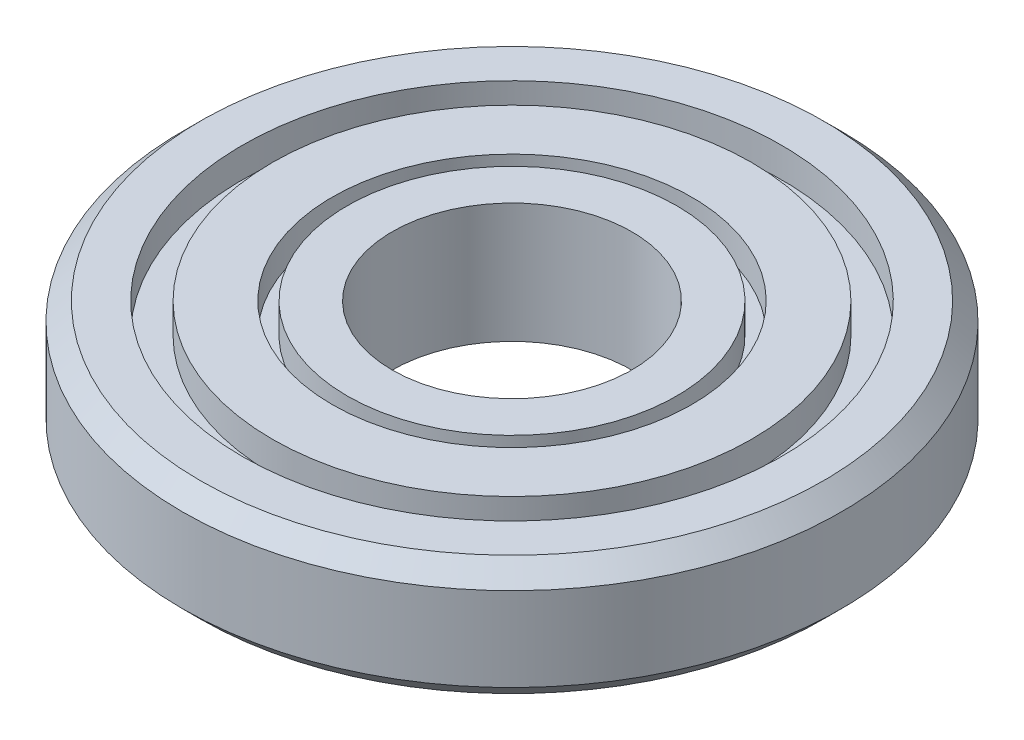
ISO-10303-21;
HEADER;
FILE_DESCRIPTION(('STEP AP214'),'2;1');
FILE_NAME('part.step','',(''),(''),'','','');
FILE_SCHEMA(('AUTOMOTIVE_DESIGN { 1 0 10303 214 1 1 1 1 }'));
ENDSEC;
DATA;
#1=APPLICATION_CONTEXT('core data for automotive mechanical design processes');
#2=APPLICATION_PROTOCOL_DEFINITION('international standard','automotive_design',2000,#1);
#3=PRODUCT_CONTEXT('',#1,'mechanical');
#4=PRODUCT('Part','Part','',(#3));
#5=PRODUCT_RELATED_PRODUCT_CATEGORY('part','',(#4));
#6=PRODUCT_DEFINITION_FORMATION('','',#4);
#7=PRODUCT_DEFINITION_CONTEXT('part definition',#1,'design');
#8=PRODUCT_DEFINITION('design','',#6,#7);
#9=PRODUCT_DEFINITION_SHAPE('','',#8);
#10=(LENGTH_UNIT() NAMED_UNIT(*) SI_UNIT(.MILLI.,.METRE.));
#11=(NAMED_UNIT(*) PLANE_ANGLE_UNIT() SI_UNIT($,.RADIAN.));
#12=(NAMED_UNIT(*) SI_UNIT($,.STERADIAN.) SOLID_ANGLE_UNIT());
#13=UNCERTAINTY_MEASURE_WITH_UNIT(LENGTH_MEASURE(1.E-05),#10,'distance_accuracy_value','');
#14=(GEOMETRIC_REPRESENTATION_CONTEXT(3) GLOBAL_UNCERTAINTY_ASSIGNED_CONTEXT((#13)) GLOBAL_UNIT_ASSIGNED_CONTEXT((#10,
#11,#12)) REPRESENTATION_CONTEXT('',''));
#15=CARTESIAN_POINT('',(0.,0.,0.));
#16=DIRECTION('',(0.,0.,1.));
#17=DIRECTION('',(1.,0.,0.));
#18=AXIS2_PLACEMENT_3D('',#15,#16,#17);
#19=CARTESIAN_POINT('',(0.,0.,0.));
#20=DIRECTION('',(0.,1.,0.));
#21=DIRECTION('',(0.,0.,1.));
#22=AXIS2_PLACEMENT_3D('',#19,#20,#21);
#23=PLANE('',#22);
#24=CARTESIAN_POINT('',(0.,0.,0.));
#25=DIRECTION('',(0.,1.,0.));
#26=DIRECTION('',(0.,0.,1.));
#27=AXIS2_PLACEMENT_3D('',#24,#25,#26);
#28=CIRCLE('',#27,2.);
#29=CARTESIAN_POINT('',(0.,0.,2.));
#30=VERTEX_POINT('',#29);
#31=EDGE_CURVE('E63',#30,#30,#28,.T.);
#32=ORIENTED_EDGE('',*,*,#31,.T.);
#33=EDGE_LOOP('',(#32));
#34=FACE_BOUND('',#33,.T.);
#35=CARTESIAN_POINT('',(0.,0.,0.));
#36=DIRECTION('',(0.,-1.,0.));
#37=DIRECTION('',(0.,0.,-1.));
#38=AXIS2_PLACEMENT_3D('',#35,#36,#37);
#39=CIRCLE('',#38,2.75);
#40=CARTESIAN_POINT('',(0.,0.,-2.75));
#41=VERTEX_POINT('',#40);
#42=EDGE_CURVE('E109',#41,#41,#39,.T.);
#43=ORIENTED_EDGE('',*,*,#42,.T.);
#44=EDGE_LOOP('',(#43));
#45=FACE_BOUND('',#44,.T.);
#46=ADVANCED_FACE('F42',(#34,#45),#23,.F.);
#47=CARTESIAN_POINT('',(0.,0.,0.));
#48=DIRECTION('',(0.,-1.,0.));
#49=DIRECTION('',(0.,0.,-1.));
#50=AXIS2_PLACEMENT_3D('',#47,#48,#49);
#51=CIRCLE('',#50,3.);
#52=CARTESIAN_POINT('',(0.,0.,-3.));
#53=VERTEX_POINT('',#52);
#54=EDGE_CURVE('E105',#53,#53,#51,.T.);
#55=ORIENTED_EDGE('',*,*,#54,.F.);
#56=EDGE_LOOP('',(#55));
#57=FACE_BOUND('',#56,.T.);
#58=CARTESIAN_POINT('',(0.,0.,0.));
#59=DIRECTION('',(0.,-1.,0.));
#60=DIRECTION('',(0.,0.,-1.));
#61=AXIS2_PLACEMENT_3D('',#58,#59,#60);
#62=CIRCLE('',#61,4.);
#63=CARTESIAN_POINT('',(0.,0.,-4.));
#64=VERTEX_POINT('',#63);
#65=EDGE_CURVE('E97',#64,#64,#62,.T.);
#66=ORIENTED_EDGE('',*,*,#65,.T.);
#67=EDGE_LOOP('',(#66));
#68=FACE_BOUND('',#67,.T.);
#69=ADVANCED_FACE('F133',(#57,#68),#23,.F.);
#70=CARTESIAN_POINT('',(0.,2.,0.));
#71=DIRECTION('',(0.,1.,0.));
#72=DIRECTION('',(0.,0.,1.));
#73=AXIS2_PLACEMENT_3D('',#70,#71,#72);
#74=PLANE('',#73);
#75=CARTESIAN_POINT('',(0.,2.,0.));
#76=DIRECTION('',(0.,1.,0.));
#77=DIRECTION('',(0.,0.,1.));
#78=AXIS2_PLACEMENT_3D('',#75,#76,#77);
#79=CIRCLE('',#78,3.);
#80=CARTESIAN_POINT('',(0.,2.,3.));
#81=VERTEX_POINT('',#80);
#82=EDGE_CURVE('E69',#81,#81,#79,.T.);
#83=ORIENTED_EDGE('',*,*,#82,.F.);
#84=EDGE_LOOP('',(#83));
#85=FACE_BOUND('',#84,.T.);
#86=CARTESIAN_POINT('',(0.,2.,0.));
#87=DIRECTION('',(0.,1.,0.));
#88=DIRECTION('',(0.,0.,1.));
#89=AXIS2_PLACEMENT_3D('',#86,#87,#88);
#90=CIRCLE('',#89,4.);
#91=CARTESIAN_POINT('',(0.,2.,4.));
#92=VERTEX_POINT('',#91);
#93=EDGE_CURVE('E85',#92,#92,#90,.T.);
#94=ORIENTED_EDGE('',*,*,#93,.T.);
#95=EDGE_LOOP('',(#94));
#96=FACE_BOUND('',#95,.T.);
#97=ADVANCED_FACE('F136',(#85,#96),#74,.T.);
#98=CARTESIAN_POINT('',(0.,2.,0.));
#99=DIRECTION('',(0.,1.,0.));
#100=DIRECTION('',(0.,0.,1.));
#101=AXIS2_PLACEMENT_3D('',#98,#99,#100);
#102=CIRCLE('',#101,2.);
#103=CARTESIAN_POINT('',(0.,2.,2.));
#104=VERTEX_POINT('',#103);
#105=EDGE_CURVE('E62',#104,#104,#102,.T.);
#106=ORIENTED_EDGE('',*,*,#105,.F.);
#107=EDGE_LOOP('',(#106));
#108=FACE_BOUND('',#107,.T.);
#109=CARTESIAN_POINT('',(0.,2.,0.));
#110=DIRECTION('',(0.,1.,0.));
#111=DIRECTION('',(0.,0.,1.));
#112=AXIS2_PLACEMENT_3D('',#109,#110,#111);
#113=CIRCLE('',#112,2.75);
#114=CARTESIAN_POINT('',(0.,2.,2.75));
#115=VERTEX_POINT('',#114);
#116=EDGE_CURVE('E73',#115,#115,#113,.T.);
#117=ORIENTED_EDGE('',*,*,#116,.T.);
#118=EDGE_LOOP('',(#117));
#119=FACE_BOUND('',#118,.T.);
#120=ADVANCED_FACE('F172',(#108,#119),#74,.T.);
#121=CARTESIAN_POINT('',(0.,2.,0.));
#122=DIRECTION('',(0.,1.,0.));
#123=DIRECTION('',(0.,0.,1.));
#124=AXIS2_PLACEMENT_3D('',#121,#122,#123);
#125=CIRCLE('',#124,5.2);
#126=CARTESIAN_POINT('',(0.,2.,5.2));
#127=VERTEX_POINT('',#126);
#128=EDGE_CURVE('E57',#127,#127,#125,.T.);
#129=ORIENTED_EDGE('',*,*,#128,.T.);
#130=EDGE_LOOP('',(#129));
#131=FACE_BOUND('',#130,.T.);
#132=CARTESIAN_POINT('',(0.,2.,0.));
#133=DIRECTION('',(0.,1.,0.));
#134=DIRECTION('',(0.,0.,1.));
#135=AXIS2_PLACEMENT_3D('',#132,#133,#134);
#136=CIRCLE('',#135,4.5);
#137=CARTESIAN_POINT('',(0.,2.,4.5));
#138=VERTEX_POINT('',#137);
#139=EDGE_CURVE('E81',#138,#138,#136,.T.);
#140=ORIENTED_EDGE('',*,*,#139,.F.);
#141=EDGE_LOOP('',(#140));
#142=FACE_BOUND('',#141,.T.);
#143=ADVANCED_FACE('F166',(#131,#142),#74,.T.);
#144=CARTESIAN_POINT('',(0.,0.,0.));
#145=DIRECTION('',(0.,1.,0.));
#146=DIRECTION('',(0.,0.,1.));
#147=AXIS2_PLACEMENT_3D('',#144,#145,#146);
#148=CIRCLE('',#147,5.2);
#149=CARTESIAN_POINT('',(0.,0.,5.2));
#150=VERTEX_POINT('',#149);
#151=EDGE_CURVE('E11',#150,#150,#148,.F.);
#152=ORIENTED_EDGE('',*,*,#151,.T.);
#153=EDGE_LOOP('',(#152));
#154=FACE_BOUND('',#153,.T.);
#155=CARTESIAN_POINT('',(0.,0.,0.));
#156=DIRECTION('',(0.,-1.,0.));
#157=DIRECTION('',(0.,0.,-1.));
#158=AXIS2_PLACEMENT_3D('',#155,#156,#157);
#159=CIRCLE('',#158,4.5);
#160=CARTESIAN_POINT('',(0.,0.,-4.5));
#161=VERTEX_POINT('',#160);
#162=EDGE_CURVE('E93',#161,#161,#159,.T.);
#163=ORIENTED_EDGE('',*,*,#162,.F.);
#164=EDGE_LOOP('',(#163));
#165=FACE_BOUND('',#164,.T.);
#166=ADVANCED_FACE('F138',(#154,#165),#23,.F.);
#167=CARTESIAN_POINT('',(0.,2.,0.));
#168=DIRECTION('',(0.,-1.,0.));
#169=DIRECTION('',(0.,0.,-1.));
#170=AXIS2_PLACEMENT_3D('',#167,#168,#169);
#171=CYLINDRICAL_SURFACE('',#170,5.5);
#172=CARTESIAN_POINT('',(0.,1.7,0.));
#173=DIRECTION('',(0.,1.,0.));
#174=DIRECTION('',(0.,0.,1.));
#175=AXIS2_PLACEMENT_3D('',#172,#173,#174);
#176=CIRCLE('',#175,5.5);
#177=CARTESIAN_POINT('',(0.,1.7,5.5));
#178=VERTEX_POINT('',#177);
#179=EDGE_CURVE('E49',#178,#178,#176,.F.);
#180=ORIENTED_EDGE('',*,*,#179,.T.);
#181=EDGE_LOOP('',(#180));
#182=FACE_BOUND('',#181,.T.);
#183=CARTESIAN_POINT('',(0.,0.3,0.));
#184=DIRECTION('',(0.,1.,0.));
#185=DIRECTION('',(0.,0.,1.));
#186=AXIS2_PLACEMENT_3D('',#183,#184,#185);
#187=CIRCLE('',#186,5.5);
#188=CARTESIAN_POINT('',(0.,0.3,5.5));
#189=VERTEX_POINT('',#188);
#190=EDGE_CURVE('E53',#189,#189,#187,.T.);
#191=ORIENTED_EDGE('',*,*,#190,.T.);
#192=EDGE_LOOP('',(#191));
#193=FACE_BOUND('',#192,.T.);
#194=ADVANCED_FACE('F165',(#182,#193),#171,.T.);
#195=CARTESIAN_POINT('',(0.,2.,0.));
#196=DIRECTION('',(0.,-1.,0.));
#197=DIRECTION('',(0.,0.,-1.));
#198=AXIS2_PLACEMENT_3D('',#195,#196,#197);
#199=CYLINDRICAL_SURFACE('',#198,2.);
#200=ORIENTED_EDGE('',*,*,#105,.T.);
#201=EDGE_LOOP('',(#200));
#202=FACE_BOUND('',#201,.T.);
#203=ORIENTED_EDGE('',*,*,#31,.F.);
#204=EDGE_LOOP('',(#203));
#205=FACE_BOUND('',#204,.T.);
#206=ADVANCED_FACE('F171',(#202,#205),#199,.F.);
#207=CARTESIAN_POINT('',(0.,1.5,0.));
#208=DIRECTION('',(0.,1.,0.));
#209=DIRECTION('',(0.,0.,1.));
#210=AXIS2_PLACEMENT_3D('',#207,#208,#209);
#211=CYLINDRICAL_SURFACE('',#210,2.75);
#212=CARTESIAN_POINT('',(0.,1.5,0.));
#213=DIRECTION('',(0.,1.,0.));
#214=DIRECTION('',(0.,0.,1.));
#215=AXIS2_PLACEMENT_3D('',#212,#213,#214);
#216=CIRCLE('',#215,2.75);
#217=CARTESIAN_POINT('',(0.,1.5,2.75));
#218=VERTEX_POINT('',#217);
#219=EDGE_CURVE('E72',#218,#218,#216,.T.);
#220=ORIENTED_EDGE('',*,*,#219,.T.);
#221=EDGE_LOOP('',(#220));
#222=FACE_BOUND('',#221,.T.);
#223=ORIENTED_EDGE('',*,*,#116,.F.);
#224=EDGE_LOOP('',(#223));
#225=FACE_BOUND('',#224,.T.);
#226=ADVANCED_FACE('F208',(#222,#225),#211,.T.);
#227=CARTESIAN_POINT('',(0.,1.5,0.));
#228=DIRECTION('',(0.,1.,0.));
#229=DIRECTION('',(0.,0.,1.));
#230=AXIS2_PLACEMENT_3D('',#227,#228,#229);
#231=CYLINDRICAL_SURFACE('',#230,3.);
#232=CARTESIAN_POINT('',(0.,1.5,0.));
#233=DIRECTION('',(0.,1.,0.));
#234=DIRECTION('',(0.,0.,1.));
#235=AXIS2_PLACEMENT_3D('',#232,#233,#234);
#236=CIRCLE('',#235,3.);
#237=CARTESIAN_POINT('',(0.,1.5,3.));
#238=VERTEX_POINT('',#237);
#239=EDGE_CURVE('E66',#238,#238,#236,.T.);
#240=ORIENTED_EDGE('',*,*,#239,.F.);
#241=EDGE_LOOP('',(#240));
#242=FACE_BOUND('',#241,.T.);
#243=ORIENTED_EDGE('',*,*,#82,.T.);
#244=EDGE_LOOP('',(#243));
#245=FACE_BOUND('',#244,.T.);
#246=ADVANCED_FACE('F202',(#242,#245),#231,.F.);
#247=CARTESIAN_POINT('',(0.,1.5,0.));
#248=DIRECTION('',(0.,1.,0.));
#249=DIRECTION('',(0.,0.,1.));
#250=AXIS2_PLACEMENT_3D('',#247,#248,#249);
#251=PLANE('',#250);
#252=ORIENTED_EDGE('',*,*,#219,.F.);
#253=EDGE_LOOP('',(#252));
#254=FACE_BOUND('',#253,.T.);
#255=ORIENTED_EDGE('',*,*,#239,.T.);
#256=EDGE_LOOP('',(#255));
#257=FACE_BOUND('',#256,.T.);
#258=ADVANCED_FACE('F193',(#254,#257),#251,.T.);
#259=CARTESIAN_POINT('',(0.,1.5,0.));
#260=DIRECTION('',(0.,1.,0.));
#261=DIRECTION('',(0.,0.,1.));
#262=AXIS2_PLACEMENT_3D('',#259,#260,#261);
#263=CYLINDRICAL_SURFACE('',#262,4.);
#264=CARTESIAN_POINT('',(0.,1.5,0.));
#265=DIRECTION('',(0.,1.,0.));
#266=DIRECTION('',(0.,0.,1.));
#267=AXIS2_PLACEMENT_3D('',#264,#265,#266);
#268=CIRCLE('',#267,4.);
#269=CARTESIAN_POINT('',(0.,1.5,4.));
#270=VERTEX_POINT('',#269);
#271=EDGE_CURVE('E84',#270,#270,#268,.T.);
#272=ORIENTED_EDGE('',*,*,#271,.T.);
#273=EDGE_LOOP('',(#272));
#274=FACE_BOUND('',#273,.T.);
#275=ORIENTED_EDGE('',*,*,#93,.F.);
#276=EDGE_LOOP('',(#275));
#277=FACE_BOUND('',#276,.T.);
#278=ADVANCED_FACE('F191',(#274,#277),#263,.T.);
#279=CARTESIAN_POINT('',(0.,1.5,0.));
#280=DIRECTION('',(0.,1.,0.));
#281=DIRECTION('',(0.,0.,1.));
#282=AXIS2_PLACEMENT_3D('',#279,#280,#281);
#283=CYLINDRICAL_SURFACE('',#282,4.5);
#284=CARTESIAN_POINT('',(0.,1.5,0.));
#285=DIRECTION('',(0.,1.,0.));
#286=DIRECTION('',(0.,0.,1.));
#287=AXIS2_PLACEMENT_3D('',#284,#285,#286);
#288=CIRCLE('',#287,4.5);
#289=CARTESIAN_POINT('',(0.,1.5,4.5));
#290=VERTEX_POINT('',#289);
#291=EDGE_CURVE('E76',#290,#290,#288,.T.);
#292=ORIENTED_EDGE('',*,*,#291,.F.);
#293=EDGE_LOOP('',(#292));
#294=FACE_BOUND('',#293,.T.);
#295=ORIENTED_EDGE('',*,*,#139,.T.);
#296=EDGE_LOOP('',(#295));
#297=FACE_BOUND('',#296,.T.);
#298=ADVANCED_FACE('F154',(#294,#297),#283,.F.);
#299=CARTESIAN_POINT('',(0.,1.5,0.));
#300=DIRECTION('',(0.,1.,0.));
#301=DIRECTION('',(0.,0.,1.));
#302=AXIS2_PLACEMENT_3D('',#299,#300,#301);
#303=PLANE('',#302);
#304=ORIENTED_EDGE('',*,*,#271,.F.);
#305=EDGE_LOOP('',(#304));
#306=FACE_BOUND('',#305,.T.);
#307=ORIENTED_EDGE('',*,*,#291,.T.);
#308=EDGE_LOOP('',(#307));
#309=FACE_BOUND('',#308,.T.);
#310=ADVANCED_FACE('F144',(#306,#309),#303,.T.);
#311=CARTESIAN_POINT('',(0.,0.5,0.));
#312=DIRECTION('',(0.,-1.,0.));
#313=DIRECTION('',(0.,0.,-1.));
#314=AXIS2_PLACEMENT_3D('',#311,#312,#313);
#315=CYLINDRICAL_SURFACE('',#314,4.);
#316=CARTESIAN_POINT('',(0.,0.5,0.));
#317=DIRECTION('',(0.,-1.,0.));
#318=DIRECTION('',(0.,0.,-1.));
#319=AXIS2_PLACEMENT_3D('',#316,#317,#318);
#320=CIRCLE('',#319,4.);
#321=CARTESIAN_POINT('',(0.,0.5,-4.));
#322=VERTEX_POINT('',#321);
#323=EDGE_CURVE('E96',#322,#322,#320,.T.);
#324=ORIENTED_EDGE('',*,*,#323,.T.);
#325=EDGE_LOOP('',(#324));
#326=FACE_BOUND('',#325,.T.);
#327=ORIENTED_EDGE('',*,*,#65,.F.);
#328=EDGE_LOOP('',(#327));
#329=FACE_BOUND('',#328,.T.);
#330=ADVANCED_FACE('F141',(#326,#329),#315,.T.);
#331=CARTESIAN_POINT('',(0.,0.5,0.));
#332=DIRECTION('',(0.,-1.,0.));
#333=DIRECTION('',(0.,0.,-1.));
#334=AXIS2_PLACEMENT_3D('',#331,#332,#333);
#335=CYLINDRICAL_SURFACE('',#334,4.5);
#336=CARTESIAN_POINT('',(0.,0.5,0.));
#337=DIRECTION('',(0.,-1.,0.));
#338=DIRECTION('',(0.,0.,-1.));
#339=AXIS2_PLACEMENT_3D('',#336,#337,#338);
#340=CIRCLE('',#339,4.5);
#341=CARTESIAN_POINT('',(0.,0.5,-4.5));
#342=VERTEX_POINT('',#341);
#343=EDGE_CURVE('E88',#342,#342,#340,.T.);
#344=ORIENTED_EDGE('',*,*,#343,.F.);
#345=EDGE_LOOP('',(#344));
#346=FACE_BOUND('',#345,.T.);
#347=ORIENTED_EDGE('',*,*,#162,.T.);
#348=EDGE_LOOP('',(#347));
#349=FACE_BOUND('',#348,.T.);
#350=ADVANCED_FACE('F143',(#346,#349),#335,.F.);
#351=CARTESIAN_POINT('',(0.,0.5,0.));
#352=DIRECTION('',(0.,-1.,0.));
#353=DIRECTION('',(0.,0.,-1.));
#354=AXIS2_PLACEMENT_3D('',#351,#352,#353);
#355=PLANE('',#354);
#356=ORIENTED_EDGE('',*,*,#323,.F.);
#357=EDGE_LOOP('',(#356));
#358=FACE_BOUND('',#357,.T.);
#359=ORIENTED_EDGE('',*,*,#343,.T.);
#360=EDGE_LOOP('',(#359));
#361=FACE_BOUND('',#360,.T.);
#362=ADVANCED_FACE('F151',(#358,#361),#355,.T.);
#363=CARTESIAN_POINT('',(0.,0.5,0.));
#364=DIRECTION('',(0.,-1.,0.));
#365=DIRECTION('',(0.,0.,-1.));
#366=AXIS2_PLACEMENT_3D('',#363,#364,#365);
#367=CYLINDRICAL_SURFACE('',#366,2.75);
#368=CARTESIAN_POINT('',(0.,0.5,0.));
#369=DIRECTION('',(0.,-1.,0.));
#370=DIRECTION('',(0.,0.,-1.));
#371=AXIS2_PLACEMENT_3D('',#368,#369,#370);
#372=CIRCLE('',#371,2.75);
#373=CARTESIAN_POINT('',(0.,0.5,-2.75));
#374=VERTEX_POINT('',#373);
#375=EDGE_CURVE('E108',#374,#374,#372,.T.);
#376=ORIENTED_EDGE('',*,*,#375,.T.);
#377=EDGE_LOOP('',(#376));
#378=FACE_BOUND('',#377,.T.);
#379=ORIENTED_EDGE('',*,*,#42,.F.);
#380=EDGE_LOOP('',(#379));
#381=FACE_BOUND('',#380,.T.);
#382=ADVANCED_FACE('F117',(#378,#381),#367,.T.);
#383=CARTESIAN_POINT('',(0.,0.5,0.));
#384=DIRECTION('',(0.,-1.,0.));
#385=DIRECTION('',(0.,0.,-1.));
#386=AXIS2_PLACEMENT_3D('',#383,#384,#385);
#387=CYLINDRICAL_SURFACE('',#386,3.);
#388=CARTESIAN_POINT('',(0.,0.5,0.));
#389=DIRECTION('',(0.,-1.,0.));
#390=DIRECTION('',(0.,0.,-1.));
#391=AXIS2_PLACEMENT_3D('',#388,#389,#390);
#392=CIRCLE('',#391,3.);
#393=CARTESIAN_POINT('',(0.,0.5,-3.));
#394=VERTEX_POINT('',#393);
#395=EDGE_CURVE('E100',#394,#394,#392,.T.);
#396=ORIENTED_EDGE('',*,*,#395,.F.);
#397=EDGE_LOOP('',(#396));
#398=FACE_BOUND('',#397,.T.);
#399=ORIENTED_EDGE('',*,*,#54,.T.);
#400=EDGE_LOOP('',(#399));
#401=FACE_BOUND('',#400,.T.);
#402=ADVANCED_FACE('F124',(#398,#401),#387,.F.);
#403=CARTESIAN_POINT('',(0.,0.5,0.));
#404=DIRECTION('',(0.,-1.,0.));
#405=DIRECTION('',(0.,0.,-1.));
#406=AXIS2_PLACEMENT_3D('',#403,#404,#405);
#407=PLANE('',#406);
#408=ORIENTED_EDGE('',*,*,#375,.F.);
#409=EDGE_LOOP('',(#408));
#410=FACE_BOUND('',#409,.T.);
#411=ORIENTED_EDGE('',*,*,#395,.T.);
#412=EDGE_LOOP('',(#411));
#413=FACE_BOUND('',#412,.T.);
#414=ADVANCED_FACE('F120',(#410,#413),#407,.T.);
#415=CARTESIAN_POINT('',(0.,2.,0.));
#416=DIRECTION('',(0.,-1.,0.));
#417=DIRECTION('',(0.,0.,-1.));
#418=AXIS2_PLACEMENT_3D('',#415,#416,#417);
#419=CONICAL_SURFACE('',#418,5.2,0.785398163397451);
#420=ORIENTED_EDGE('',*,*,#179,.F.);
#421=EDGE_LOOP('',(#420));
#422=FACE_BOUND('',#421,.T.);
#423=ORIENTED_EDGE('',*,*,#128,.F.);
#424=EDGE_LOOP('',(#423));
#425=FACE_BOUND('',#424,.T.);
#426=ADVANCED_FACE('F123',(#422,#425),#419,.T.);
#427=CARTESIAN_POINT('',(0.,0.3,0.));
#428=DIRECTION('',(0.,1.,0.));
#429=DIRECTION('',(0.,0.,1.));
#430=AXIS2_PLACEMENT_3D('',#427,#428,#429);
#431=CONICAL_SURFACE('',#430,5.5,0.78539816339745);
#432=ORIENTED_EDGE('',*,*,#151,.F.);
#433=EDGE_LOOP('',(#432));
#434=FACE_BOUND('',#433,.T.);
#435=ORIENTED_EDGE('',*,*,#190,.F.);
#436=EDGE_LOOP('',(#435));
#437=FACE_BOUND('',#436,.T.);
#438=ADVANCED_FACE('F44',(#434,#437),#431,.T.);
#439=CLOSED_SHELL('',(#46,#69,#97,#120,#143,#166,#194,#206,#226,#246,#258,#278,#298,#310,#330,
#350,#362,#382,#402,#414,#426,#438));
#440=MANIFOLD_SOLID_BREP('B2',#439);
#441=ADVANCED_BREP_SHAPE_REPRESENTATION('',(#18,#440),#14);
#442=SHAPE_DEFINITION_REPRESENTATION(#9,#441);
ENDSEC;
END-ISO-10303-21;
